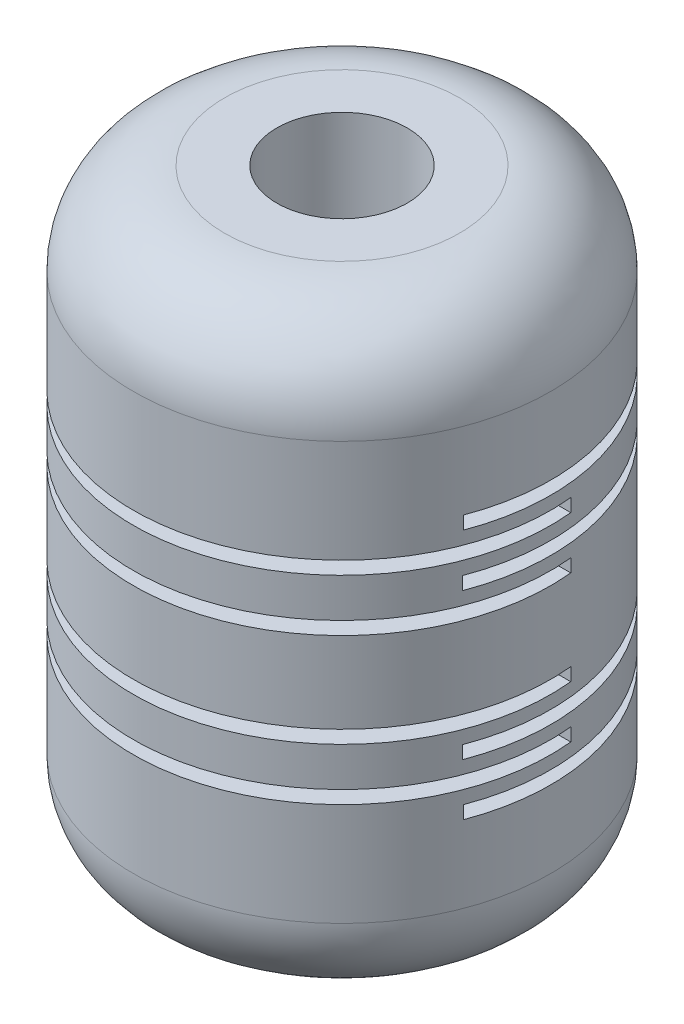
ISO-10303-21;
HEADER;
FILE_DESCRIPTION(('STEP AP214'),'2;1');
FILE_NAME('part.step','',(''),(''),'','','');
FILE_SCHEMA(('AUTOMOTIVE_DESIGN { 1 0 10303 214 1 1 1 1 }'));
ENDSEC;
DATA;
#1=APPLICATION_CONTEXT('core data for automotive mechanical design processes');
#2=APPLICATION_PROTOCOL_DEFINITION('international standard','automotive_design',2000,#1);
#3=PRODUCT_CONTEXT('',#1,'mechanical');
#4=PRODUCT('Part','Part','',(#3));
#5=PRODUCT_RELATED_PRODUCT_CATEGORY('part','',(#4));
#6=PRODUCT_DEFINITION_FORMATION('','',#4);
#7=PRODUCT_DEFINITION_CONTEXT('part definition',#1,'design');
#8=PRODUCT_DEFINITION('design','',#6,#7);
#9=PRODUCT_DEFINITION_SHAPE('','',#8);
#10=(LENGTH_UNIT() NAMED_UNIT(*) SI_UNIT(.MILLI.,.METRE.));
#11=(NAMED_UNIT(*) PLANE_ANGLE_UNIT() SI_UNIT($,.RADIAN.));
#12=(NAMED_UNIT(*) SI_UNIT($,.STERADIAN.) SOLID_ANGLE_UNIT());
#13=UNCERTAINTY_MEASURE_WITH_UNIT(LENGTH_MEASURE(1.E-05),#10,'distance_accuracy_value','');
#14=(GEOMETRIC_REPRESENTATION_CONTEXT(3) GLOBAL_UNCERTAINTY_ASSIGNED_CONTEXT((#13)) GLOBAL_UNIT_ASSIGNED_CONTEXT((#10,
#11,#12)) REPRESENTATION_CONTEXT('',''));
#15=CARTESIAN_POINT('',(0.,0.,0.));
#16=DIRECTION('',(0.,0.,1.));
#17=DIRECTION('',(1.,0.,0.));
#18=AXIS2_PLACEMENT_3D('',#15,#16,#17);
#19=CARTESIAN_POINT('',(-32.4453380376427,-3.83426816016442,-0.806915282737464));
#20=DIRECTION('',(0.,0.,1.));
#21=DIRECTION('',(0.,-1.,0.));
#22=AXIS2_PLACEMENT_3D('',#19,#20,#21);
#23=PLANE('',#22);
#24=DIRECTION('',(0.,-1.,0.));
#25=VECTOR('',#24,1.);
#26=CARTESIAN_POINT('',(-2.36619689089575,20.7745316098034,-0.806915282737455));
#27=LINE('',#26,#25);
#28=CARTESIAN_POINT('',(-2.36619689089575,-3.5556055847556,-0.806915282737455));
#29=VERTEX_POINT('',#28);
#30=CARTESIAN_POINT('',(-2.36619689089575,-4.0556055847556,-0.806915282737464));
#31=VERTEX_POINT('',#30);
#32=EDGE_CURVE('E39',#29,#31,#27,.T.);
#33=ORIENTED_EDGE('',*,*,#32,.F.);
#34=DIRECTION('',(1.,0.,0.));
#35=VECTOR('',#34,1.);
#36=CARTESIAN_POINT('',(-32.4453380376427,-3.5556055847556,-0.806915282737463));
#37=LINE('',#36,#35);
#38=CARTESIAN_POINT('',(-7.9592014503017,-3.5556055847556,-0.806915282737463));
#39=VERTEX_POINT('',#38);
#40=EDGE_CURVE('E284',#39,#29,#37,.T.);
#41=ORIENTED_EDGE('',*,*,#40,.F.);
#42=DIRECTION('',(0.,1.,0.));
#43=VECTOR('',#42,1.);
#44=CARTESIAN_POINT('',(-7.9592014503017,-11.5,-0.806915282737467));
#45=LINE('',#44,#43);
#46=CARTESIAN_POINT('',(-7.9592014503017,-4.0556055847556,-0.806915282737464));
#47=VERTEX_POINT('',#46);
#48=EDGE_CURVE('E321',#39,#47,#45,.F.);
#49=ORIENTED_EDGE('',*,*,#48,.T.);
#50=DIRECTION('',(1.,0.,0.));
#51=VECTOR('',#50,1.);
#52=CARTESIAN_POINT('',(-32.4453380376427,-4.0556055847556,-0.806915282737464));
#53=LINE('',#52,#51);
#54=EDGE_CURVE('E278',#47,#31,#53,.T.);
#55=ORIENTED_EDGE('',*,*,#54,.T.);
#56=EDGE_LOOP('',(#33,#41,#49,#55));
#57=FACE_BOUND('',#56,.T.);
#58=ADVANCED_FACE('F17',(#57),#23,.T.);
#59=CARTESIAN_POINT('',(-32.6569119482311,-1.43952399957925,-0.806915282737464));
#60=DIRECTION('',(0.,0.,-1.));
#61=DIRECTION('',(-1.,0.,0.));
#62=AXIS2_PLACEMENT_3D('',#59,#60,#61);
#63=PLANE('',#62);
#64=DIRECTION('',(1.,0.,0.));
#65=VECTOR('',#64,1.);
#66=CARTESIAN_POINT('',(-32.6569119482311,-1.5556055847556,-0.806915282737463));
#67=LINE('',#66,#65);
#68=CARTESIAN_POINT('',(2.36619689089575,-1.5556055847556,-0.806915282737463));
#69=VERTEX_POINT('',#68);
#70=CARTESIAN_POINT('',(7.9592014503017,-1.5556055847556,-0.806915282737463));
#71=VERTEX_POINT('',#70);
#72=EDGE_CURVE('E303',#69,#71,#67,.T.);
#73=ORIENTED_EDGE('',*,*,#72,.F.);
#74=DIRECTION('',(0.,-1.,0.));
#75=VECTOR('',#74,1.);
#76=CARTESIAN_POINT('',(2.36619689089575,20.7745316098034,-0.806915282737464));
#77=LINE('',#76,#75);
#78=CARTESIAN_POINT('',(2.36619689089575,-2.05560558475559,-0.806915282737464));
#79=VERTEX_POINT('',#78);
#80=EDGE_CURVE('E51',#69,#79,#77,.T.);
#81=ORIENTED_EDGE('',*,*,#80,.T.);
#82=DIRECTION('',(1.,0.,0.));
#83=VECTOR('',#82,1.);
#84=CARTESIAN_POINT('',(-32.6569119482311,-2.0556055847556,-0.806915282737463));
#85=LINE('',#84,#83);
#86=CARTESIAN_POINT('',(7.95920145030171,-2.0556055847556,-0.806915282737463));
#87=VERTEX_POINT('',#86);
#88=EDGE_CURVE('E302',#79,#87,#85,.T.);
#89=ORIENTED_EDGE('',*,*,#88,.T.);
#90=DIRECTION('',(0.,1.,0.));
#91=VECTOR('',#90,1.);
#92=CARTESIAN_POINT('',(7.9592014503017,-11.5,-0.806915282737464));
#93=LINE('',#92,#91);
#94=EDGE_CURVE('E350',#71,#87,#93,.F.);
#95=ORIENTED_EDGE('',*,*,#94,.F.);
#96=EDGE_LOOP('',(#73,#81,#89,#95));
#97=FACE_BOUND('',#96,.T.);
#98=ADVANCED_FACE('F534',(#97),#63,.F.);
#99=CARTESIAN_POINT('',(-32.4453380376427,3.83426816016442,-0.806915282737464));
#100=DIRECTION('',(0.,0.,-1.));
#101=DIRECTION('',(0.,1.,0.));
#102=AXIS2_PLACEMENT_3D('',#99,#100,#101);
#103=PLANE('',#102);
#104=DIRECTION('',(1.,0.,0.));
#105=VECTOR('',#104,1.);
#106=CARTESIAN_POINT('',(-32.4453380376427,4.0556055847556,-0.806915282737464));
#107=LINE('',#106,#105);
#108=CARTESIAN_POINT('',(2.36619689089575,4.0556055847556,-0.806915282737464));
#109=VERTEX_POINT('',#108);
#110=CARTESIAN_POINT('',(7.9592014503017,4.0556055847556,-0.806915282737464));
#111=VERTEX_POINT('',#110);
#112=EDGE_CURVE('E312',#109,#111,#107,.T.);
#113=ORIENTED_EDGE('',*,*,#112,.F.);
#114=DIRECTION('',(0.,-1.,0.));
#115=VECTOR('',#114,1.);
#116=CARTESIAN_POINT('',(2.36619689089575,20.7745316098034,-0.80691528273747));
#117=LINE('',#116,#115);
#118=CARTESIAN_POINT('',(2.36619689089575,3.5556055847556,-0.80691528273747));
#119=VERTEX_POINT('',#118);
#120=EDGE_CURVE('E623',#109,#119,#117,.T.);
#121=ORIENTED_EDGE('',*,*,#120,.T.);
#122=DIRECTION('',(1.,0.,0.));
#123=VECTOR('',#122,1.);
#124=CARTESIAN_POINT('',(-32.4453380376427,3.5556055847556,-0.806915282737464));
#125=LINE('',#124,#123);
#126=CARTESIAN_POINT('',(7.95920145030171,3.5556055847556,-0.806915282737464));
#127=VERTEX_POINT('',#126);
#128=EDGE_CURVE('E311',#119,#127,#125,.T.);
#129=ORIENTED_EDGE('',*,*,#128,.T.);
#130=DIRECTION('',(0.,1.,0.));
#131=VECTOR('',#130,1.);
#132=CARTESIAN_POINT('',(7.9592014503017,-11.5,-0.806915282737458));
#133=LINE('',#132,#131);
#134=EDGE_CURVE('E365',#111,#127,#133,.F.);
#135=ORIENTED_EDGE('',*,*,#134,.F.);
#136=EDGE_LOOP('',(#113,#121,#129,#135));
#137=FACE_BOUND('',#136,.T.);
#138=ADVANCED_FACE('F541',(#137),#103,.F.);
#139=CARTESIAN_POINT('',(-32.6569119482311,1.43952399957925,-0.806915282737464));
#140=DIRECTION('',(0.,0.,1.));
#141=DIRECTION('',(1.,0.,0.));
#142=AXIS2_PLACEMENT_3D('',#139,#140,#141);
#143=PLANE('',#142);
#144=DIRECTION('',(0.,-1.,0.));
#145=VECTOR('',#144,1.);
#146=CARTESIAN_POINT('',(-2.36619689089575,20.7745316098034,-0.806915282737464));
#147=LINE('',#146,#145);
#148=CARTESIAN_POINT('',(-2.36619689089575,2.05560558475559,-0.806915282737464));
#149=VERTEX_POINT('',#148);
#150=CARTESIAN_POINT('',(-2.36619689089575,1.5556055847556,-0.806915282737463));
#151=VERTEX_POINT('',#150);
#152=EDGE_CURVE('E238',#149,#151,#147,.T.);
#153=ORIENTED_EDGE('',*,*,#152,.F.);
#154=DIRECTION('',(1.,0.,0.));
#155=VECTOR('',#154,1.);
#156=CARTESIAN_POINT('',(-32.6569119482311,2.0556055847556,-0.806915282737463));
#157=LINE('',#156,#155);
#158=CARTESIAN_POINT('',(-7.9592014503017,2.0556055847556,-0.806915282737463));
#159=VERTEX_POINT('',#158);
#160=EDGE_CURVE('E273',#159,#149,#157,.T.);
#161=ORIENTED_EDGE('',*,*,#160,.F.);
#162=DIRECTION('',(0.,1.,0.));
#163=VECTOR('',#162,1.);
#164=CARTESIAN_POINT('',(-7.9592014503017,-11.5,-0.806915282737464));
#165=LINE('',#164,#163);
#166=CARTESIAN_POINT('',(-7.9592014503017,1.5556055847556,-0.806915282737463));
#167=VERTEX_POINT('',#166);
#168=EDGE_CURVE('E409',#159,#167,#165,.F.);
#169=ORIENTED_EDGE('',*,*,#168,.T.);
#170=DIRECTION('',(1.,0.,0.));
#171=VECTOR('',#170,1.);
#172=CARTESIAN_POINT('',(-32.6569119482311,1.5556055847556,-0.806915282737463));
#173=LINE('',#172,#171);
#174=EDGE_CURVE('E259',#167,#151,#173,.T.);
#175=ORIENTED_EDGE('',*,*,#174,.T.);
#176=EDGE_LOOP('',(#153,#161,#169,#175));
#177=FACE_BOUND('',#176,.T.);
#178=ADVANCED_FACE('F458',(#177),#143,.T.);
#179=CARTESIAN_POINT('',(0.,-11.5,0.));
#180=DIRECTION('',(0.,1.,0.));
#181=DIRECTION('',(0.,0.,1.));
#182=AXIS2_PLACEMENT_3D('',#179,#180,#181);
#183=CYLINDRICAL_SURFACE('',#182,8.);
#184=CARTESIAN_POINT('',(0.,8.,0.));
#185=DIRECTION('',(0.,-1.,0.));
#186=DIRECTION('',(0.,0.,-1.));
#187=AXIS2_PLACEMENT_3D('',#184,#185,#186);
#188=CIRCLE('',#187,8.);
#189=CARTESIAN_POINT('',(0.,8.,-8.));
#190=VERTEX_POINT('',#189);
#191=EDGE_CURVE('E437',#190,#190,#188,.T.);
#192=ORIENTED_EDGE('',*,*,#191,.T.);
#193=EDGE_LOOP('',(#192));
#194=FACE_BOUND('',#193,.T.);
#195=CARTESIAN_POINT('',(0.,-8.,0.));
#196=DIRECTION('',(0.,-1.,0.));
#197=DIRECTION('',(0.,0.,-1.));
#198=AXIS2_PLACEMENT_3D('',#195,#196,#197);
#199=CIRCLE('',#198,8.);
#200=CARTESIAN_POINT('',(0.,-8.,-8.));
#201=VERTEX_POINT('',#200);
#202=EDGE_CURVE('E433',#201,#201,#199,.F.);
#203=ORIENTED_EDGE('',*,*,#202,.T.);
#204=EDGE_LOOP('',(#203));
#205=FACE_BOUND('',#204,.T.);
#206=CARTESIAN_POINT('',(0.,2.0556055847556,0.));
#207=DIRECTION('',(0.,-1.,0.));
#208=DIRECTION('',(0.,0.,-1.));
#209=AXIS2_PLACEMENT_3D('',#206,#207,#208);
#210=CIRCLE('',#209,8.);
#211=CARTESIAN_POINT('',(7.9592014503017,2.0556055847556,-0.806915282737463));
#212=VERTEX_POINT('',#211);
#213=EDGE_CURVE('E416',#212,#159,#210,.T.);
#214=ORIENTED_EDGE('',*,*,#213,.F.);
#215=DIRECTION('',(0.,1.,0.));
#216=VECTOR('',#215,1.);
#217=CARTESIAN_POINT('',(7.9592014503017,-11.5,-0.806915282737464));
#218=LINE('',#217,#216);
#219=CARTESIAN_POINT('',(7.9592014503017,1.5556055847556,-0.806915282737463));
#220=VERTEX_POINT('',#219);
#221=EDGE_CURVE('E413',#220,#212,#218,.T.);
#222=ORIENTED_EDGE('',*,*,#221,.F.);
#223=CARTESIAN_POINT('',(0.,1.5556055847556,0.));
#224=DIRECTION('',(0.,-1.,0.));
#225=DIRECTION('',(0.,0.,-1.));
#226=AXIS2_PLACEMENT_3D('',#223,#224,#225);
#227=CIRCLE('',#226,8.);
#228=EDGE_CURVE('E256',#220,#167,#227,.T.);
#229=ORIENTED_EDGE('',*,*,#228,.T.);
#230=ORIENTED_EDGE('',*,*,#168,.F.);
#231=EDGE_LOOP('',(#214,#222,#229,#230));
#232=FACE_BOUND('',#231,.T.);
#233=CARTESIAN_POINT('',(0.,-3.0556055847556,0.));
#234=DIRECTION('',(0.,1.,0.));
#235=DIRECTION('',(0.,0.,1.));
#236=AXIS2_PLACEMENT_3D('',#233,#234,#235);
#237=CIRCLE('',#236,8.);
#238=CARTESIAN_POINT('',(7.47467309621452,-3.0556055847556,2.85118608735502));
#239=VERTEX_POINT('',#238);
#240=CARTESIAN_POINT('',(-7.47467309621452,-3.0556055847556,2.85118608735502));
#241=VERTEX_POINT('',#240);
#242=EDGE_CURVE('E344',#239,#241,#237,.T.);
#243=ORIENTED_EDGE('',*,*,#242,.F.);
#244=DIRECTION('',(0.,1.,0.));
#245=VECTOR('',#244,1.);
#246=CARTESIAN_POINT('',(7.47467309621452,-11.5,2.85118608735502));
#247=LINE('',#246,#245);
#248=CARTESIAN_POINT('',(7.47467309621452,-2.5556055847556,2.85118608735502));
#249=VERTEX_POINT('',#248);
#250=EDGE_CURVE('E337',#249,#239,#247,.F.);
#251=ORIENTED_EDGE('',*,*,#250,.F.);
#252=CARTESIAN_POINT('',(0.,-2.5556055847556,0.));
#253=DIRECTION('',(0.,1.,0.));
#254=DIRECTION('',(0.,0.,1.));
#255=AXIS2_PLACEMENT_3D('',#252,#253,#254);
#256=CIRCLE('',#255,8.);
#257=CARTESIAN_POINT('',(-7.47467309621452,-2.5556055847556,2.85118608735502));
#258=VERTEX_POINT('',#257);
#259=EDGE_CURVE('E333',#249,#258,#256,.T.);
#260=ORIENTED_EDGE('',*,*,#259,.T.);
#261=DIRECTION('',(0.,1.,0.));
#262=VECTOR('',#261,1.);
#263=CARTESIAN_POINT('',(-7.47467309621452,-11.5,2.85118608735502));
#264=LINE('',#263,#262);
#265=EDGE_CURVE('E340',#241,#258,#264,.T.);
#266=ORIENTED_EDGE('',*,*,#265,.F.);
#267=EDGE_LOOP('',(#243,#251,#260,#266));
#268=FACE_BOUND('',#267,.T.);
#269=CARTESIAN_POINT('',(0.,-3.5556055847556,0.));
#270=DIRECTION('',(0.,-1.,0.));
#271=DIRECTION('',(0.,0.,-1.));
#272=AXIS2_PLACEMENT_3D('',#269,#270,#271);
#273=CIRCLE('',#272,8.);
#274=CARTESIAN_POINT('',(7.9592014503017,-3.5556055847556,-0.806915282737463));
#275=VERTEX_POINT('',#274);
#276=EDGE_CURVE('E330',#275,#39,#273,.T.);
#277=ORIENTED_EDGE('',*,*,#276,.F.);
#278=DIRECTION('',(0.,1.,0.));
#279=VECTOR('',#278,1.);
#280=CARTESIAN_POINT('',(7.9592014503017,-11.5,-0.806915282737467));
#281=LINE('',#280,#279);
#282=CARTESIAN_POINT('',(7.9592014503017,-4.0556055847556,-0.806915282737464));
#283=VERTEX_POINT('',#282);
#284=EDGE_CURVE('E326',#283,#275,#281,.T.);
#285=ORIENTED_EDGE('',*,*,#284,.F.);
#286=CARTESIAN_POINT('',(0.,-4.0556055847556,0.));
#287=DIRECTION('',(0.,-1.,0.));
#288=DIRECTION('',(0.,0.,-1.));
#289=AXIS2_PLACEMENT_3D('',#286,#287,#288);
#290=CIRCLE('',#289,8.);
#291=EDGE_CURVE('E317',#283,#47,#290,.T.);
#292=ORIENTED_EDGE('',*,*,#291,.T.);
#293=ORIENTED_EDGE('',*,*,#48,.F.);
#294=EDGE_LOOP('',(#277,#285,#292,#293));
#295=FACE_BOUND('',#294,.T.);
#296=ORIENTED_EDGE('',*,*,#94,.T.);
#297=CARTESIAN_POINT('',(0.,-2.0556055847556,0.));
#298=DIRECTION('',(0.,-1.,0.));
#299=DIRECTION('',(0.,0.,-1.));
#300=AXIS2_PLACEMENT_3D('',#297,#298,#299);
#301=CIRCLE('',#300,8.);
#302=CARTESIAN_POINT('',(-7.95920145030171,-2.0556055847556,-0.806915282737463));
#303=VERTEX_POINT('',#302);
#304=EDGE_CURVE('E358',#87,#303,#301,.T.);
#305=ORIENTED_EDGE('',*,*,#304,.T.);
#306=DIRECTION('',(0.,1.,0.));
#307=VECTOR('',#306,1.);
#308=CARTESIAN_POINT('',(-7.9592014503017,-11.5,-0.806915282737464));
#309=LINE('',#308,#307);
#310=CARTESIAN_POINT('',(-7.9592014503017,-1.5556055847556,-0.806915282737463));
#311=VERTEX_POINT('',#310);
#312=EDGE_CURVE('E354',#303,#311,#309,.T.);
#313=ORIENTED_EDGE('',*,*,#312,.T.);
#314=CARTESIAN_POINT('',(0.,-1.5556055847556,0.));
#315=DIRECTION('',(0.,-1.,0.));
#316=DIRECTION('',(0.,0.,-1.));
#317=AXIS2_PLACEMENT_3D('',#314,#315,#316);
#318=CIRCLE('',#317,8.);
#319=EDGE_CURVE('E347',#71,#311,#318,.T.);
#320=ORIENTED_EDGE('',*,*,#319,.F.);
#321=EDGE_LOOP('',(#296,#305,#313,#320));
#322=FACE_BOUND('',#321,.T.);
#323=ORIENTED_EDGE('',*,*,#134,.T.);
#324=CARTESIAN_POINT('',(0.,3.5556055847556,0.));
#325=DIRECTION('',(0.,-1.,0.));
#326=DIRECTION('',(0.,0.,-1.));
#327=AXIS2_PLACEMENT_3D('',#324,#325,#326);
#328=CIRCLE('',#327,8.);
#329=CARTESIAN_POINT('',(-7.95920145030171,3.5556055847556,-0.806915282737464));
#330=VERTEX_POINT('',#329);
#331=EDGE_CURVE('E373',#127,#330,#328,.T.);
#332=ORIENTED_EDGE('',*,*,#331,.T.);
#333=DIRECTION('',(0.,1.,0.));
#334=VECTOR('',#333,1.);
#335=CARTESIAN_POINT('',(-7.9592014503017,-11.5,-0.806915282737458));
#336=LINE('',#335,#334);
#337=CARTESIAN_POINT('',(-7.9592014503017,4.0556055847556,-0.806915282737464));
#338=VERTEX_POINT('',#337);
#339=EDGE_CURVE('E369',#330,#338,#336,.T.);
#340=ORIENTED_EDGE('',*,*,#339,.T.);
#341=CARTESIAN_POINT('',(0.,4.0556055847556,0.));
#342=DIRECTION('',(0.,-1.,0.));
#343=DIRECTION('',(0.,0.,-1.));
#344=AXIS2_PLACEMENT_3D('',#341,#342,#343);
#345=CIRCLE('',#344,8.);
#346=EDGE_CURVE('E362',#111,#338,#345,.T.);
#347=ORIENTED_EDGE('',*,*,#346,.F.);
#348=EDGE_LOOP('',(#323,#332,#340,#347));
#349=FACE_BOUND('',#348,.T.);
#350=DIRECTION('',(0.,1.,0.));
#351=VECTOR('',#350,1.);
#352=CARTESIAN_POINT('',(7.47467309621452,-11.5,2.85118608735502));
#353=LINE('',#352,#351);
#354=CARTESIAN_POINT('',(7.47467309621452,2.5556055847556,2.85118608735502));
#355=VERTEX_POINT('',#354);
#356=CARTESIAN_POINT('',(7.47467309621452,3.0556055847556,2.85118608735502));
#357=VERTEX_POINT('',#356);
#358=EDGE_CURVE('E384',#355,#357,#353,.T.);
#359=ORIENTED_EDGE('',*,*,#358,.T.);
#360=CARTESIAN_POINT('',(0.,3.0556055847556,0.));
#361=DIRECTION('',(0.,1.,0.));
#362=DIRECTION('',(0.,0.,1.));
#363=AXIS2_PLACEMENT_3D('',#360,#361,#362);
#364=CIRCLE('',#363,8.);
#365=CARTESIAN_POINT('',(-7.47467309621452,3.0556055847556,2.85118608735502));
#366=VERTEX_POINT('',#365);
#367=EDGE_CURVE('E388',#357,#366,#364,.T.);
#368=ORIENTED_EDGE('',*,*,#367,.T.);
#369=DIRECTION('',(0.,1.,0.));
#370=VECTOR('',#369,1.);
#371=CARTESIAN_POINT('',(-7.47467309621452,-11.5,2.85118608735502));
#372=LINE('',#371,#370);
#373=CARTESIAN_POINT('',(-7.47467309621452,2.5556055847556,2.85118608735502));
#374=VERTEX_POINT('',#373);
#375=EDGE_CURVE('E380',#366,#374,#372,.F.);
#376=ORIENTED_EDGE('',*,*,#375,.T.);
#377=CARTESIAN_POINT('',(0.,2.5556055847556,0.));
#378=DIRECTION('',(0.,1.,0.));
#379=DIRECTION('',(0.,0.,1.));
#380=AXIS2_PLACEMENT_3D('',#377,#378,#379);
#381=CIRCLE('',#380,8.);
#382=EDGE_CURVE('E377',#355,#374,#381,.T.);
#383=ORIENTED_EDGE('',*,*,#382,.F.);
#384=EDGE_LOOP('',(#359,#368,#376,#383));
#385=FACE_BOUND('',#384,.T.);
#386=CARTESIAN_POINT('',(0.,5.0556055847556,0.));
#387=DIRECTION('',(0.,-1.,0.));
#388=DIRECTION('',(0.,0.,-1.));
#389=AXIS2_PLACEMENT_3D('',#386,#387,#388);
#390=CIRCLE('',#389,8.);
#391=CARTESIAN_POINT('',(-7.48448014592821,5.0556055847556,2.82534191651321));
#392=VERTEX_POINT('',#391);
#393=CARTESIAN_POINT('',(7.4844801459282,5.0556055847556,2.82534191651321));
#394=VERTEX_POINT('',#393);
#395=EDGE_CURVE('E404',#392,#394,#390,.T.);
#396=ORIENTED_EDGE('',*,*,#395,.F.);
#397=DIRECTION('',(0.,1.,0.));
#398=VECTOR('',#397,1.);
#399=CARTESIAN_POINT('',(-7.4844801459282,-11.5,2.82534191651321));
#400=LINE('',#399,#398);
#401=CARTESIAN_POINT('',(-7.4844801459282,4.5556055847556,2.82534191651321));
#402=VERTEX_POINT('',#401);
#403=EDGE_CURVE('E396',#392,#402,#400,.F.);
#404=ORIENTED_EDGE('',*,*,#403,.T.);
#405=CARTESIAN_POINT('',(0.,4.5556055847556,0.));
#406=DIRECTION('',(0.,-1.,0.));
#407=DIRECTION('',(0.,0.,-1.));
#408=AXIS2_PLACEMENT_3D('',#405,#406,#407);
#409=CIRCLE('',#408,8.);
#410=CARTESIAN_POINT('',(7.4844801459282,4.5556055847556,2.82534191651321));
#411=VERTEX_POINT('',#410);
#412=EDGE_CURVE('E392',#402,#411,#409,.T.);
#413=ORIENTED_EDGE('',*,*,#412,.T.);
#414=DIRECTION('',(0.,1.,0.));
#415=VECTOR('',#414,1.);
#416=CARTESIAN_POINT('',(7.4844801459282,-11.5,2.82534191651321));
#417=LINE('',#416,#415);
#418=EDGE_CURVE('E400',#411,#394,#417,.T.);
#419=ORIENTED_EDGE('',*,*,#418,.T.);
#420=EDGE_LOOP('',(#396,#404,#413,#419));
#421=FACE_BOUND('',#420,.T.);
#422=DIRECTION('',(0.,1.,0.));
#423=VECTOR('',#422,1.);
#424=CARTESIAN_POINT('',(-7.4844801459282,-11.5,2.82534191651321));
#425=LINE('',#424,#423);
#426=CARTESIAN_POINT('',(-7.48448014592821,-5.0556055847556,2.82534191651321));
#427=VERTEX_POINT('',#426);
#428=CARTESIAN_POINT('',(-7.48448014592821,-4.5556055847556,2.82534191651321));
#429=VERTEX_POINT('',#428);
#430=EDGE_CURVE('E430',#427,#429,#425,.T.);
#431=ORIENTED_EDGE('',*,*,#430,.F.);
#432=CARTESIAN_POINT('',(0.,-5.0556055847556,0.));
#433=DIRECTION('',(0.,-1.,0.));
#434=DIRECTION('',(0.,0.,-1.));
#435=AXIS2_PLACEMENT_3D('',#432,#433,#434);
#436=CIRCLE('',#435,8.);
#437=CARTESIAN_POINT('',(7.4844801459282,-5.0556055847556,2.82534191651321));
#438=VERTEX_POINT('',#437);
#439=EDGE_CURVE('E426',#427,#438,#436,.T.);
#440=ORIENTED_EDGE('',*,*,#439,.T.);
#441=DIRECTION('',(0.,1.,0.));
#442=VECTOR('',#441,1.);
#443=CARTESIAN_POINT('',(7.4844801459282,-11.5,2.82534191651321));
#444=LINE('',#443,#442);
#445=CARTESIAN_POINT('',(7.4844801459282,-4.5556055847556,2.82534191651321));
#446=VERTEX_POINT('',#445);
#447=EDGE_CURVE('E419',#446,#438,#444,.F.);
#448=ORIENTED_EDGE('',*,*,#447,.F.);
#449=CARTESIAN_POINT('',(0.,-4.5556055847556,0.));
#450=DIRECTION('',(0.,-1.,0.));
#451=DIRECTION('',(0.,0.,-1.));
#452=AXIS2_PLACEMENT_3D('',#449,#450,#451);
#453=CIRCLE('',#452,8.);
#454=EDGE_CURVE('E422',#429,#446,#453,.T.);
#455=ORIENTED_EDGE('',*,*,#454,.F.);
#456=EDGE_LOOP('',(#431,#440,#448,#455));
#457=FACE_BOUND('',#456,.T.);
#458=ADVANCED_FACE('F454',(#194,#205,#232,#268,#295,#322,#349,#385,#421,#457),#183,.T.);
#459=CARTESIAN_POINT('',(0.,-11.5,0.));
#460=DIRECTION('',(0.,-1.,0.));
#461=DIRECTION('',(1.,0.,0.));
#462=AXIS2_PLACEMENT_3D('',#459,#460,#461);
#463=PLANE('',#462);
#464=CARTESIAN_POINT('',(0.,-11.5,0.));
#465=DIRECTION('',(0.,-1.,0.));
#466=DIRECTION('',(1.,0.,0.));
#467=AXIS2_PLACEMENT_3D('',#464,#465,#466);
#468=CIRCLE('',#467,2.5);
#469=CARTESIAN_POINT('',(2.5,-11.5,0.));
#470=VERTEX_POINT('',#469);
#471=EDGE_CURVE('E679',#470,#470,#468,.T.);
#472=ORIENTED_EDGE('',*,*,#471,.F.);
#473=EDGE_LOOP('',(#472));
#474=FACE_BOUND('',#473,.T.);
#475=CARTESIAN_POINT('',(0.,-11.5,0.));
#476=DIRECTION('',(0.,-1.,0.));
#477=DIRECTION('',(0.,0.,-1.));
#478=AXIS2_PLACEMENT_3D('',#475,#476,#477);
#479=CIRCLE('',#478,4.5);
#480=CARTESIAN_POINT('',(0.,-11.5,-4.5));
#481=VERTEX_POINT('',#480);
#482=EDGE_CURVE('E11',#481,#481,#479,.T.);
#483=ORIENTED_EDGE('',*,*,#482,.T.);
#484=EDGE_LOOP('',(#483));
#485=FACE_BOUND('',#484,.T.);
#486=ADVANCED_FACE('F457',(#474,#485),#463,.T.);
#487=CARTESIAN_POINT('',(0.,11.5,0.));
#488=DIRECTION('',(0.,-1.,0.));
#489=DIRECTION('',(1.,0.,0.));
#490=AXIS2_PLACEMENT_3D('',#487,#488,#489);
#491=PLANE('',#490);
#492=CARTESIAN_POINT('',(0.,11.5,0.));
#493=DIRECTION('',(0.,-1.,0.));
#494=DIRECTION('',(0.,0.,-1.));
#495=AXIS2_PLACEMENT_3D('',#492,#493,#494);
#496=CIRCLE('',#495,2.5);
#497=CARTESIAN_POINT('',(0.,11.5,-2.5));
#498=VERTEX_POINT('',#497);
#499=EDGE_CURVE('E260',#498,#498,#496,.T.);
#500=ORIENTED_EDGE('',*,*,#499,.T.);
#501=EDGE_LOOP('',(#500));
#502=FACE_BOUND('',#501,.T.);
#503=CARTESIAN_POINT('',(0.,11.5,0.));
#504=DIRECTION('',(0.,-1.,0.));
#505=DIRECTION('',(0.,0.,-1.));
#506=AXIS2_PLACEMENT_3D('',#503,#504,#505);
#507=CIRCLE('',#506,4.5);
#508=CARTESIAN_POINT('',(0.,11.5,-4.5));
#509=VERTEX_POINT('',#508);
#510=EDGE_CURVE('E27',#509,#509,#507,.F.);
#511=ORIENTED_EDGE('',*,*,#510,.T.);
#512=EDGE_LOOP('',(#511));
#513=FACE_BOUND('',#512,.T.);
#514=ADVANCED_FACE('F446',(#502,#513),#491,.F.);
#515=DIRECTION('',(0.,-1.,0.));
#516=VECTOR('',#515,1.);
#517=CARTESIAN_POINT('',(2.36619689089575,20.7745316098034,-0.806915282737455));
#518=LINE('',#517,#516);
#519=CARTESIAN_POINT('',(2.36619689089575,-4.0556055847556,-0.806915282737464));
#520=VERTEX_POINT('',#519);
#521=CARTESIAN_POINT('',(2.36619689089575,-3.5556055847556,-0.806915282737455));
#522=VERTEX_POINT('',#521);
#523=EDGE_CURVE('E560',#520,#522,#518,.F.);
#524=ORIENTED_EDGE('',*,*,#523,.F.);
#525=EDGE_CURVE('E283',#520,#283,#53,.T.);
#526=ORIENTED_EDGE('',*,*,#525,.T.);
#527=ORIENTED_EDGE('',*,*,#284,.T.);
#528=EDGE_CURVE('E282',#522,#275,#37,.T.);
#529=ORIENTED_EDGE('',*,*,#528,.F.);
#530=EDGE_LOOP('',(#524,#526,#527,#529));
#531=FACE_BOUND('',#530,.T.);
#532=ADVANCED_FACE('F537',(#531),#23,.T.);
#533=CARTESIAN_POINT('',(-32.4453380376427,-3.55560558475561,3.76739227795042));
#534=DIRECTION('',(0.,-1.,0.));
#535=DIRECTION('',(0.,0.,-1.));
#536=AXIS2_PLACEMENT_3D('',#533,#534,#535);
#537=PLANE('',#536);
#538=CARTESIAN_POINT('',(0.,-3.5556055847556,0.));
#539=DIRECTION('',(0.,-1.,0.));
#540=DIRECTION('',(0.,0.,-1.));
#541=AXIS2_PLACEMENT_3D('',#538,#539,#540);
#542=CIRCLE('',#541,2.5);
#543=EDGE_CURVE('E267',#522,#29,#542,.T.);
#544=ORIENTED_EDGE('',*,*,#543,.F.);
#545=ORIENTED_EDGE('',*,*,#528,.T.);
#546=ORIENTED_EDGE('',*,*,#276,.T.);
#547=ORIENTED_EDGE('',*,*,#40,.T.);
#548=EDGE_LOOP('',(#544,#545,#546,#547));
#549=FACE_BOUND('',#548,.T.);
#550=ADVANCED_FACE('F548',(#549),#537,.T.);
#551=CARTESIAN_POINT('',(-32.4453380376427,-4.0556055847556,3.76739227795042));
#552=DIRECTION('',(0.,-1.,0.));
#553=DIRECTION('',(0.,0.,-1.));
#554=AXIS2_PLACEMENT_3D('',#551,#552,#553);
#555=PLANE('',#554);
#556=ORIENTED_EDGE('',*,*,#525,.F.);
#557=CARTESIAN_POINT('',(0.,-4.0556055847556,0.));
#558=DIRECTION('',(0.,-1.,0.));
#559=DIRECTION('',(0.,0.,-1.));
#560=AXIS2_PLACEMENT_3D('',#557,#558,#559);
#561=CIRCLE('',#560,2.5);
#562=EDGE_CURVE('E565',#520,#31,#561,.T.);
#563=ORIENTED_EDGE('',*,*,#562,.T.);
#564=ORIENTED_EDGE('',*,*,#54,.F.);
#565=ORIENTED_EDGE('',*,*,#291,.F.);
#566=EDGE_LOOP('',(#556,#563,#564,#565));
#567=FACE_BOUND('',#566,.T.);
#568=ADVANCED_FACE('F554',(#567),#555,.F.);
#569=CARTESIAN_POINT('',(-32.7885763689421,-2.72397413058213,2.85118608735502));
#570=DIRECTION('',(0.,0.,-1.));
#571=DIRECTION('',(-1.,0.,0.));
#572=AXIS2_PLACEMENT_3D('',#569,#570,#571);
#573=PLANE('',#572);
#574=ORIENTED_EDGE('',*,*,#265,.T.);
#575=DIRECTION('',(1.,0.,0.));
#576=VECTOR('',#575,1.);
#577=CARTESIAN_POINT('',(-32.7885763689421,-2.5556055847556,2.85118608735502));
#578=LINE('',#577,#576);
#579=EDGE_CURVE('E289',#258,#249,#578,.T.);
#580=ORIENTED_EDGE('',*,*,#579,.T.);
#581=ORIENTED_EDGE('',*,*,#250,.T.);
#582=DIRECTION('',(1.,0.,0.));
#583=VECTOR('',#582,1.);
#584=CARTESIAN_POINT('',(-32.7885763689421,-3.0556055847556,2.85118608735502));
#585=LINE('',#584,#583);
#586=EDGE_CURVE('E293',#241,#239,#585,.T.);
#587=ORIENTED_EDGE('',*,*,#586,.F.);
#588=EDGE_LOOP('',(#574,#580,#581,#587));
#589=FACE_BOUND('',#588,.T.);
#590=ADVANCED_FACE('F967',(#589),#573,.T.);
#591=CARTESIAN_POINT('',(-32.7885763689421,-3.0556055847556,-3.17239214200526));
#592=DIRECTION('',(0.,1.,0.));
#593=DIRECTION('',(0.,0.,1.));
#594=AXIS2_PLACEMENT_3D('',#591,#592,#593);
#595=PLANE('',#594);
#596=CARTESIAN_POINT('',(0.,-3.0556055847556,0.));
#597=DIRECTION('',(0.,1.,0.));
#598=DIRECTION('',(0.,0.,1.));
#599=AXIS2_PLACEMENT_3D('',#596,#597,#598);
#600=CIRCLE('',#599,2.5);
#601=CARTESIAN_POINT('',(0.,-3.0556055847556,2.5));
#602=VERTEX_POINT('',#601);
#603=EDGE_CURVE('E647',#602,#602,#600,.T.);
#604=ORIENTED_EDGE('',*,*,#603,.F.);
#605=EDGE_LOOP('',(#604));
#606=FACE_BOUND('',#605,.T.);
#607=ORIENTED_EDGE('',*,*,#242,.T.);
#608=ORIENTED_EDGE('',*,*,#586,.T.);
#609=EDGE_LOOP('',(#607,#608));
#610=FACE_BOUND('',#609,.T.);
#611=ADVANCED_FACE('F957',(#606,#610),#595,.T.);
#612=CARTESIAN_POINT('',(-32.7885763689421,-2.5556055847556,-3.17239214200526));
#613=DIRECTION('',(0.,1.,0.));
#614=DIRECTION('',(0.,0.,1.));
#615=AXIS2_PLACEMENT_3D('',#612,#613,#614);
#616=PLANE('',#615);
#617=CARTESIAN_POINT('',(0.,-2.5556055847556,0.));
#618=DIRECTION('',(0.,1.,0.));
#619=DIRECTION('',(0.,0.,1.));
#620=AXIS2_PLACEMENT_3D('',#617,#618,#619);
#621=CIRCLE('',#620,2.5);
#622=CARTESIAN_POINT('',(0.,-2.5556055847556,2.5));
#623=VERTEX_POINT('',#622);
#624=EDGE_CURVE('E643',#623,#623,#621,.T.);
#625=ORIENTED_EDGE('',*,*,#624,.T.);
#626=EDGE_LOOP('',(#625));
#627=FACE_BOUND('',#626,.T.);
#628=ORIENTED_EDGE('',*,*,#579,.F.);
#629=ORIENTED_EDGE('',*,*,#259,.F.);
#630=EDGE_LOOP('',(#628,#629));
#631=FACE_BOUND('',#630,.T.);
#632=ADVANCED_FACE('F946',(#627,#631),#616,.F.);
#633=CARTESIAN_POINT('',(-32.6569119482311,-2.0556055847556,3.97539758705534));
#634=DIRECTION('',(0.,-1.,0.));
#635=DIRECTION('',(0.,0.,-1.));
#636=AXIS2_PLACEMENT_3D('',#633,#634,#635);
#637=PLANE('',#636);
#638=ORIENTED_EDGE('',*,*,#88,.F.);
#639=CARTESIAN_POINT('',(0.,-2.0556055847556,0.));
#640=DIRECTION('',(0.,-1.,0.));
#641=DIRECTION('',(0.,0.,-1.));
#642=AXIS2_PLACEMENT_3D('',#639,#640,#641);
#643=CIRCLE('',#642,2.5);
#644=CARTESIAN_POINT('',(-2.36619689089575,-2.05560558475559,-0.806915282737464));
#645=VERTEX_POINT('',#644);
#646=EDGE_CURVE('E639',#79,#645,#643,.T.);
#647=ORIENTED_EDGE('',*,*,#646,.T.);
#648=EDGE_CURVE('E294',#303,#645,#85,.T.);
#649=ORIENTED_EDGE('',*,*,#648,.F.);
#650=ORIENTED_EDGE('',*,*,#304,.F.);
#651=EDGE_LOOP('',(#638,#647,#649,#650));
#652=FACE_BOUND('',#651,.T.);
#653=ADVANCED_FACE('F936',(#652),#637,.F.);
#654=ORIENTED_EDGE('',*,*,#648,.T.);
#655=DIRECTION('',(0.,-1.,0.));
#656=VECTOR('',#655,1.);
#657=CARTESIAN_POINT('',(-2.36619689089575,20.7745316098034,-0.806915282737464));
#658=LINE('',#657,#656);
#659=CARTESIAN_POINT('',(-2.36619689089575,-1.5556055847556,-0.806915282737463));
#660=VERTEX_POINT('',#659);
#661=EDGE_CURVE('E633',#645,#660,#658,.F.);
#662=ORIENTED_EDGE('',*,*,#661,.T.);
#663=EDGE_CURVE('E298',#311,#660,#67,.T.);
#664=ORIENTED_EDGE('',*,*,#663,.F.);
#665=ORIENTED_EDGE('',*,*,#312,.F.);
#666=EDGE_LOOP('',(#654,#662,#664,#665));
#667=FACE_BOUND('',#666,.T.);
#668=ADVANCED_FACE('F544',(#667),#63,.F.);
#669=CARTESIAN_POINT('',(-32.6569119482311,-1.5556055847556,3.97539758705534));
#670=DIRECTION('',(0.,-1.,0.));
#671=DIRECTION('',(0.,0.,-1.));
#672=AXIS2_PLACEMENT_3D('',#669,#670,#671);
#673=PLANE('',#672);
#674=CARTESIAN_POINT('',(0.,-1.5556055847556,0.));
#675=DIRECTION('',(0.,-1.,0.));
#676=DIRECTION('',(0.,0.,-1.));
#677=AXIS2_PLACEMENT_3D('',#674,#675,#676);
#678=CIRCLE('',#677,2.5);
#679=EDGE_CURVE('E630',#69,#660,#678,.T.);
#680=ORIENTED_EDGE('',*,*,#679,.F.);
#681=ORIENTED_EDGE('',*,*,#72,.T.);
#682=ORIENTED_EDGE('',*,*,#319,.T.);
#683=ORIENTED_EDGE('',*,*,#663,.T.);
#684=EDGE_LOOP('',(#680,#681,#682,#683));
#685=FACE_BOUND('',#684,.T.);
#686=ADVANCED_FACE('F915',(#685),#673,.T.);
#687=CARTESIAN_POINT('',(-32.4453380376427,3.55560558475561,3.76739227795042));
#688=DIRECTION('',(0.,-1.,0.));
#689=DIRECTION('',(0.,0.,-1.));
#690=AXIS2_PLACEMENT_3D('',#687,#688,#689);
#691=PLANE('',#690);
#692=ORIENTED_EDGE('',*,*,#128,.F.);
#693=CARTESIAN_POINT('',(0.,3.5556055847556,0.));
#694=DIRECTION('',(0.,-1.,0.));
#695=DIRECTION('',(0.,0.,-1.));
#696=AXIS2_PLACEMENT_3D('',#693,#694,#695);
#697=CIRCLE('',#696,2.5);
#698=CARTESIAN_POINT('',(-2.36619689089575,3.5556055847556,-0.80691528273747));
#699=VERTEX_POINT('',#698);
#700=EDGE_CURVE('E626',#119,#699,#697,.T.);
#701=ORIENTED_EDGE('',*,*,#700,.T.);
#702=EDGE_CURVE('E313',#330,#699,#125,.T.);
#703=ORIENTED_EDGE('',*,*,#702,.F.);
#704=ORIENTED_EDGE('',*,*,#331,.F.);
#705=EDGE_LOOP('',(#692,#701,#703,#704));
#706=FACE_BOUND('',#705,.T.);
#707=ADVANCED_FACE('F903',(#706),#691,.F.);
#708=ORIENTED_EDGE('',*,*,#702,.T.);
#709=DIRECTION('',(0.,-1.,0.));
#710=VECTOR('',#709,1.);
#711=CARTESIAN_POINT('',(-2.36619689089575,20.7745316098034,-0.80691528273747));
#712=LINE('',#711,#710);
#713=CARTESIAN_POINT('',(-2.36619689089575,4.0556055847556,-0.806915282737464));
#714=VERTEX_POINT('',#713);
#715=EDGE_CURVE('E619',#699,#714,#712,.F.);
#716=ORIENTED_EDGE('',*,*,#715,.T.);
#717=EDGE_CURVE('E307',#338,#714,#107,.T.);
#718=ORIENTED_EDGE('',*,*,#717,.F.);
#719=ORIENTED_EDGE('',*,*,#339,.F.);
#720=EDGE_LOOP('',(#708,#716,#718,#719));
#721=FACE_BOUND('',#720,.T.);
#722=ADVANCED_FACE('F892',(#721),#103,.F.);
#723=CARTESIAN_POINT('',(-32.4453380376427,4.0556055847556,3.76739227795042));
#724=DIRECTION('',(0.,-1.,0.));
#725=DIRECTION('',(0.,0.,-1.));
#726=AXIS2_PLACEMENT_3D('',#723,#724,#725);
#727=PLANE('',#726);
#728=CARTESIAN_POINT('',(0.,4.0556055847556,0.));
#729=DIRECTION('',(0.,-1.,0.));
#730=DIRECTION('',(0.,0.,-1.));
#731=AXIS2_PLACEMENT_3D('',#728,#729,#730);
#732=CIRCLE('',#731,2.5);
#733=EDGE_CURVE('E616',#109,#714,#732,.T.);
#734=ORIENTED_EDGE('',*,*,#733,.F.);
#735=ORIENTED_EDGE('',*,*,#112,.T.);
#736=ORIENTED_EDGE('',*,*,#346,.T.);
#737=ORIENTED_EDGE('',*,*,#717,.T.);
#738=EDGE_LOOP('',(#734,#735,#736,#737));
#739=FACE_BOUND('',#738,.T.);
#740=ADVANCED_FACE('F883',(#739),#727,.T.);
#741=CARTESIAN_POINT('',(-32.7885763689421,3.0556055847556,-3.17239214200526));
#742=DIRECTION('',(0.,1.,0.));
#743=DIRECTION('',(0.,0.,1.));
#744=AXIS2_PLACEMENT_3D('',#741,#742,#743);
#745=PLANE('',#744);
#746=CARTESIAN_POINT('',(0.,3.0556055847556,0.));
#747=DIRECTION('',(0.,1.,0.));
#748=DIRECTION('',(0.,0.,1.));
#749=AXIS2_PLACEMENT_3D('',#746,#747,#748);
#750=CIRCLE('',#749,2.5);
#751=CARTESIAN_POINT('',(0.,3.0556055847556,2.5));
#752=VERTEX_POINT('',#751);
#753=EDGE_CURVE('E612',#752,#752,#750,.T.);
#754=ORIENTED_EDGE('',*,*,#753,.T.);
#755=EDGE_LOOP('',(#754));
#756=FACE_BOUND('',#755,.T.);
#757=DIRECTION('',(1.,0.,0.));
#758=VECTOR('',#757,1.);
#759=CARTESIAN_POINT('',(-32.7885763689421,3.0556055847556,2.85118608735502));
#760=LINE('',#759,#758);
#761=EDGE_CURVE('E502',#366,#357,#760,.T.);
#762=ORIENTED_EDGE('',*,*,#761,.F.);
#763=ORIENTED_EDGE('',*,*,#367,.F.);
#764=EDGE_LOOP('',(#762,#763));
#765=FACE_BOUND('',#764,.T.);
#766=ADVANCED_FACE('F873',(#756,#765),#745,.F.);
#767=CARTESIAN_POINT('',(-32.7885763689421,2.72397413058213,2.85118608735502));
#768=DIRECTION('',(0.,0.,1.));
#769=DIRECTION('',(1.,0.,0.));
#770=AXIS2_PLACEMENT_3D('',#767,#768,#769);
#771=PLANE('',#770);
#772=DIRECTION('',(1.,0.,0.));
#773=VECTOR('',#772,1.);
#774=CARTESIAN_POINT('',(-32.7885763689421,2.5556055847556,2.85118608735502));
#775=LINE('',#774,#773);
#776=EDGE_CURVE('E499',#374,#355,#775,.T.);
#777=ORIENTED_EDGE('',*,*,#776,.F.);
#778=ORIENTED_EDGE('',*,*,#375,.F.);
#779=ORIENTED_EDGE('',*,*,#761,.T.);
#780=ORIENTED_EDGE('',*,*,#358,.F.);
#781=EDGE_LOOP('',(#777,#778,#779,#780));
#782=FACE_BOUND('',#781,.T.);
#783=ADVANCED_FACE('F861',(#782),#771,.F.);
#784=CARTESIAN_POINT('',(-32.7885763689421,2.5556055847556,-3.17239214200526));
#785=DIRECTION('',(0.,1.,0.));
#786=DIRECTION('',(0.,0.,1.));
#787=AXIS2_PLACEMENT_3D('',#784,#785,#786);
#788=PLANE('',#787);
#789=CARTESIAN_POINT('',(0.,2.5556055847556,0.));
#790=DIRECTION('',(0.,1.,0.));
#791=DIRECTION('',(0.,0.,1.));
#792=AXIS2_PLACEMENT_3D('',#789,#790,#791);
#793=CIRCLE('',#792,2.5);
#794=CARTESIAN_POINT('',(0.,2.5556055847556,2.5));
#795=VERTEX_POINT('',#794);
#796=EDGE_CURVE('E608',#795,#795,#793,.T.);
#797=ORIENTED_EDGE('',*,*,#796,.F.);
#798=EDGE_LOOP('',(#797));
#799=FACE_BOUND('',#798,.T.);
#800=ORIENTED_EDGE('',*,*,#382,.T.);
#801=ORIENTED_EDGE('',*,*,#776,.T.);
#802=EDGE_LOOP('',(#800,#801));
#803=FACE_BOUND('',#802,.T.);
#804=ADVANCED_FACE('F849',(#799,#803),#788,.T.);
#805=CARTESIAN_POINT('',(-32.3615001834182,5.0556055847556,1.06826960109174));
#806=DIRECTION('',(0.,-1.,0.));
#807=DIRECTION('',(0.,0.,-1.));
#808=AXIS2_PLACEMENT_3D('',#805,#806,#807);
#809=PLANE('',#808);
#810=CARTESIAN_POINT('',(0.,5.0556055847556,0.));
#811=DIRECTION('',(0.,-1.,0.));
#812=DIRECTION('',(0.,0.,-1.));
#813=AXIS2_PLACEMENT_3D('',#810,#811,#812);
#814=CIRCLE('',#813,2.5);
#815=CARTESIAN_POINT('',(0.,5.0556055847556,-2.5));
#816=VERTEX_POINT('',#815);
#817=EDGE_CURVE('E604',#816,#816,#814,.T.);
#818=ORIENTED_EDGE('',*,*,#817,.F.);
#819=EDGE_LOOP('',(#818));
#820=FACE_BOUND('',#819,.T.);
#821=ORIENTED_EDGE('',*,*,#395,.T.);
#822=DIRECTION('',(1.,0.,0.));
#823=VECTOR('',#822,1.);
#824=CARTESIAN_POINT('',(-32.3615001834182,5.0556055847556,2.82534191651321));
#825=LINE('',#824,#823);
#826=EDGE_CURVE('E271',#392,#394,#825,.T.);
#827=ORIENTED_EDGE('',*,*,#826,.F.);
#828=EDGE_LOOP('',(#821,#827));
#829=FACE_BOUND('',#828,.T.);
#830=ADVANCED_FACE('F529',(#820,#829),#809,.T.);
#831=CARTESIAN_POINT('',(-32.3615001834182,7.38488510251045,2.82534191651321));
#832=DIRECTION('',(0.,0.,1.));
#833=DIRECTION('',(1.,0.,0.));
#834=AXIS2_PLACEMENT_3D('',#831,#832,#833);
#835=PLANE('',#834);
#836=DIRECTION('',(1.,0.,0.));
#837=VECTOR('',#836,1.);
#838=CARTESIAN_POINT('',(-32.3615001834182,4.5556055847556,2.82534191651321));
#839=LINE('',#838,#837);
#840=EDGE_CURVE('E277',#402,#411,#839,.T.);
#841=ORIENTED_EDGE('',*,*,#840,.F.);
#842=ORIENTED_EDGE('',*,*,#403,.F.);
#843=ORIENTED_EDGE('',*,*,#826,.T.);
#844=ORIENTED_EDGE('',*,*,#418,.F.);
#845=EDGE_LOOP('',(#841,#842,#843,#844));
#846=FACE_BOUND('',#845,.T.);
#847=ADVANCED_FACE('F516',(#846),#835,.F.);
#848=CARTESIAN_POINT('',(-32.3615001834182,4.5556055847556,1.06826960109174));
#849=DIRECTION('',(0.,-1.,0.));
#850=DIRECTION('',(0.,0.,-1.));
#851=AXIS2_PLACEMENT_3D('',#848,#849,#850);
#852=PLANE('',#851);
#853=CARTESIAN_POINT('',(0.,4.5556055847556,0.));
#854=DIRECTION('',(0.,-1.,0.));
#855=DIRECTION('',(0.,0.,-1.));
#856=AXIS2_PLACEMENT_3D('',#853,#854,#855);
#857=CIRCLE('',#856,2.5);
#858=CARTESIAN_POINT('',(0.,4.5556055847556,-2.5));
#859=VERTEX_POINT('',#858);
#860=EDGE_CURVE('E599',#859,#859,#857,.T.);
#861=ORIENTED_EDGE('',*,*,#860,.T.);
#862=EDGE_LOOP('',(#861));
#863=FACE_BOUND('',#862,.T.);
#864=ORIENTED_EDGE('',*,*,#840,.T.);
#865=ORIENTED_EDGE('',*,*,#412,.F.);
#866=EDGE_LOOP('',(#864,#865));
#867=FACE_BOUND('',#866,.T.);
#868=ADVANCED_FACE('F518',(#863,#867),#852,.F.);
#869=DIRECTION('',(0.,-1.,0.));
#870=VECTOR('',#869,1.);
#871=CARTESIAN_POINT('',(2.36619689089575,20.7745316098034,-0.806915282737464));
#872=LINE('',#871,#870);
#873=CARTESIAN_POINT('',(2.36619689089575,1.5556055847556,-0.806915282737463));
#874=VERTEX_POINT('',#873);
#875=CARTESIAN_POINT('',(2.36619689089575,2.05560558475559,-0.806915282737464));
#876=VERTEX_POINT('',#875);
#877=EDGE_CURVE('E235',#874,#876,#872,.F.);
#878=ORIENTED_EDGE('',*,*,#877,.F.);
#879=EDGE_CURVE('E249',#874,#220,#173,.T.);
#880=ORIENTED_EDGE('',*,*,#879,.T.);
#881=ORIENTED_EDGE('',*,*,#221,.T.);
#882=EDGE_CURVE('E251',#876,#212,#157,.T.);
#883=ORIENTED_EDGE('',*,*,#882,.F.);
#884=EDGE_LOOP('',(#878,#880,#881,#883));
#885=FACE_BOUND('',#884,.T.);
#886=ADVANCED_FACE('F247',(#885),#143,.T.);
#887=CARTESIAN_POINT('',(-32.6569119482311,2.0556055847556,3.97539758705534));
#888=DIRECTION('',(0.,-1.,0.));
#889=DIRECTION('',(0.,0.,-1.));
#890=AXIS2_PLACEMENT_3D('',#887,#888,#889);
#891=PLANE('',#890);
#892=CARTESIAN_POINT('',(0.,2.0556055847556,0.));
#893=DIRECTION('',(0.,-1.,0.));
#894=DIRECTION('',(0.,0.,-1.));
#895=AXIS2_PLACEMENT_3D('',#892,#893,#894);
#896=CIRCLE('',#895,2.5);
#897=EDGE_CURVE('E592',#876,#149,#896,.T.);
#898=ORIENTED_EDGE('',*,*,#897,.F.);
#899=ORIENTED_EDGE('',*,*,#882,.T.);
#900=ORIENTED_EDGE('',*,*,#213,.T.);
#901=ORIENTED_EDGE('',*,*,#160,.T.);
#902=EDGE_LOOP('',(#898,#899,#900,#901));
#903=FACE_BOUND('',#902,.T.);
#904=ADVANCED_FACE('F527',(#903),#891,.T.);
#905=CARTESIAN_POINT('',(-32.6569119482311,1.5556055847556,3.97539758705534));
#906=DIRECTION('',(0.,-1.,0.));
#907=DIRECTION('',(0.,0.,-1.));
#908=AXIS2_PLACEMENT_3D('',#905,#906,#907);
#909=PLANE('',#908);
#910=ORIENTED_EDGE('',*,*,#879,.F.);
#911=CARTESIAN_POINT('',(0.,1.5556055847556,0.));
#912=DIRECTION('',(0.,-1.,0.));
#913=DIRECTION('',(0.,0.,-1.));
#914=AXIS2_PLACEMENT_3D('',#911,#912,#913);
#915=CIRCLE('',#914,2.5);
#916=EDGE_CURVE('E231',#874,#151,#915,.T.);
#917=ORIENTED_EDGE('',*,*,#916,.T.);
#918=ORIENTED_EDGE('',*,*,#174,.F.);
#919=ORIENTED_EDGE('',*,*,#228,.F.);
#920=EDGE_LOOP('',(#910,#917,#918,#919));
#921=FACE_BOUND('',#920,.T.);
#922=ADVANCED_FACE('F254',(#921),#909,.F.);
#923=CARTESIAN_POINT('',(-32.3615001834182,-5.0556055847556,1.06826960109174));
#924=DIRECTION('',(0.,-1.,0.));
#925=DIRECTION('',(0.,0.,-1.));
#926=AXIS2_PLACEMENT_3D('',#923,#924,#925);
#927=PLANE('',#926);
#928=CARTESIAN_POINT('',(0.,-5.0556055847556,0.));
#929=DIRECTION('',(0.,-1.,0.));
#930=DIRECTION('',(0.,0.,-1.));
#931=AXIS2_PLACEMENT_3D('',#928,#929,#930);
#932=CIRCLE('',#931,2.5);
#933=CARTESIAN_POINT('',(0.,-5.0556055847556,-2.5));
#934=VERTEX_POINT('',#933);
#935=EDGE_CURVE('E243',#934,#934,#932,.T.);
#936=ORIENTED_EDGE('',*,*,#935,.T.);
#937=EDGE_LOOP('',(#936));
#938=FACE_BOUND('',#937,.T.);
#939=DIRECTION('',(1.,0.,0.));
#940=VECTOR('',#939,1.);
#941=CARTESIAN_POINT('',(-32.3615001834182,-5.0556055847556,2.82534191651321));
#942=LINE('',#941,#940);
#943=EDGE_CURVE('E288',#427,#438,#942,.T.);
#944=ORIENTED_EDGE('',*,*,#943,.T.);
#945=ORIENTED_EDGE('',*,*,#439,.F.);
#946=EDGE_LOOP('',(#944,#945));
#947=FACE_BOUND('',#946,.T.);
#948=ADVANCED_FACE('F788',(#938,#947),#927,.F.);
#949=CARTESIAN_POINT('',(-32.3615001834182,-4.5556055847556,1.06826960109174));
#950=DIRECTION('',(0.,-1.,0.));
#951=DIRECTION('',(0.,0.,-1.));
#952=AXIS2_PLACEMENT_3D('',#949,#950,#951);
#953=PLANE('',#952);
#954=CARTESIAN_POINT('',(0.,-4.5556055847556,0.));
#955=DIRECTION('',(0.,-1.,0.));
#956=DIRECTION('',(0.,0.,-1.));
#957=AXIS2_PLACEMENT_3D('',#954,#955,#956);
#958=CIRCLE('',#957,2.5);
#959=CARTESIAN_POINT('',(0.,-4.5556055847556,-2.5));
#960=VERTEX_POINT('',#959);
#961=EDGE_CURVE('E21',#960,#960,#958,.T.);
#962=ORIENTED_EDGE('',*,*,#961,.F.);
#963=EDGE_LOOP('',(#962));
#964=FACE_BOUND('',#963,.T.);
#965=ORIENTED_EDGE('',*,*,#454,.T.);
#966=DIRECTION('',(1.,0.,0.));
#967=VECTOR('',#966,1.);
#968=CARTESIAN_POINT('',(-32.3615001834182,-4.5556055847556,2.82534191651321));
#969=LINE('',#968,#967);
#970=EDGE_CURVE('E322',#429,#446,#969,.T.);
#971=ORIENTED_EDGE('',*,*,#970,.F.);
#972=EDGE_LOOP('',(#965,#971));
#973=FACE_BOUND('',#972,.T.);
#974=ADVANCED_FACE('F492',(#964,#973),#953,.T.);
#975=CARTESIAN_POINT('',(-32.3615001834182,-7.38488510251045,2.82534191651321));
#976=DIRECTION('',(0.,0.,-1.));
#977=DIRECTION('',(-1.,0.,0.));
#978=AXIS2_PLACEMENT_3D('',#975,#976,#977);
#979=PLANE('',#978);
#980=ORIENTED_EDGE('',*,*,#430,.T.);
#981=ORIENTED_EDGE('',*,*,#970,.T.);
#982=ORIENTED_EDGE('',*,*,#447,.T.);
#983=ORIENTED_EDGE('',*,*,#943,.F.);
#984=EDGE_LOOP('',(#980,#981,#982,#983));
#985=FACE_BOUND('',#984,.T.);
#986=ADVANCED_FACE('F451',(#985),#979,.T.);
#987=CARTESIAN_POINT('',(0.,8.,0.));
#988=DIRECTION('',(0.,-1.,0.));
#989=DIRECTION('',(0.,0.,-1.));
#990=AXIS2_PLACEMENT_3D('',#987,#988,#989);
#991=TOROIDAL_SURFACE('',#990,4.5,3.5);
#992=ORIENTED_EDGE('',*,*,#510,.F.);
#993=EDGE_LOOP('',(#992));
#994=FACE_BOUND('',#993,.T.);
#995=ORIENTED_EDGE('',*,*,#191,.F.);
#996=EDGE_LOOP('',(#995));
#997=FACE_BOUND('',#996,.T.);
#998=ADVANCED_FACE('F448',(#994,#997),#991,.T.);
#999=CARTESIAN_POINT('',(0.,-8.,0.));
#1000=DIRECTION('',(0.,-1.,0.));
#1001=DIRECTION('',(0.,0.,-1.));
#1002=AXIS2_PLACEMENT_3D('',#999,#1000,#1001);
#1003=TOROIDAL_SURFACE('',#1002,4.5,3.5);
#1004=ORIENTED_EDGE('',*,*,#202,.F.);
#1005=EDGE_LOOP('',(#1004));
#1006=FACE_BOUND('',#1005,.T.);
#1007=ORIENTED_EDGE('',*,*,#482,.F.);
#1008=EDGE_LOOP('',(#1007));
#1009=FACE_BOUND('',#1008,.T.);
#1010=ADVANCED_FACE('F19',(#1006,#1009),#1003,.T.);
#1011=CARTESIAN_POINT('',(0.,20.7745316098034,0.));
#1012=DIRECTION('',(0.,-1.,0.));
#1013=DIRECTION('',(0.,0.,-1.));
#1014=AXIS2_PLACEMENT_3D('',#1011,#1012,#1013);
#1015=CYLINDRICAL_SURFACE('',#1014,2.5);
#1016=ORIENTED_EDGE('',*,*,#543,.T.);
#1017=ORIENTED_EDGE('',*,*,#32,.T.);
#1018=ORIENTED_EDGE('',*,*,#562,.F.);
#1019=ORIENTED_EDGE('',*,*,#523,.T.);
#1020=EDGE_LOOP('',(#1016,#1017,#1018,#1019));
#1021=FACE_BOUND('',#1020,.T.);
#1022=ORIENTED_EDGE('',*,*,#603,.T.);
#1023=EDGE_LOOP('',(#1022));
#1024=FACE_BOUND('',#1023,.T.);
#1025=ORIENTED_EDGE('',*,*,#961,.T.);
#1026=EDGE_LOOP('',(#1025));
#1027=FACE_BOUND('',#1026,.T.);
#1028=ADVANCED_FACE('F657',(#1021,#1024,#1027),#1015,.F.);
#1029=ORIENTED_EDGE('',*,*,#471,.T.);
#1030=EDGE_LOOP('',(#1029));
#1031=FACE_BOUND('',#1030,.T.);
#1032=ORIENTED_EDGE('',*,*,#935,.F.);
#1033=EDGE_LOOP('',(#1032));
#1034=FACE_BOUND('',#1033,.T.);
#1035=ADVANCED_FACE('F670',(#1031,#1034),#1015,.F.);
#1036=ORIENTED_EDGE('',*,*,#80,.F.);
#1037=ORIENTED_EDGE('',*,*,#679,.T.);
#1038=ORIENTED_EDGE('',*,*,#661,.F.);
#1039=ORIENTED_EDGE('',*,*,#646,.F.);
#1040=EDGE_LOOP('',(#1036,#1037,#1038,#1039));
#1041=FACE_BOUND('',#1040,.T.);
#1042=ORIENTED_EDGE('',*,*,#897,.T.);
#1043=ORIENTED_EDGE('',*,*,#152,.T.);
#1044=ORIENTED_EDGE('',*,*,#916,.F.);
#1045=ORIENTED_EDGE('',*,*,#877,.T.);
#1046=EDGE_LOOP('',(#1042,#1043,#1044,#1045));
#1047=FACE_BOUND('',#1046,.T.);
#1048=ORIENTED_EDGE('',*,*,#796,.T.);
#1049=EDGE_LOOP('',(#1048));
#1050=FACE_BOUND('',#1049,.T.);
#1051=ORIENTED_EDGE('',*,*,#624,.F.);
#1052=EDGE_LOOP('',(#1051));
#1053=FACE_BOUND('',#1052,.T.);
#1054=ADVANCED_FACE('F233',(#1041,#1047,#1050,#1053),#1015,.F.);
#1055=ORIENTED_EDGE('',*,*,#860,.F.);
#1056=EDGE_LOOP('',(#1055));
#1057=FACE_BOUND('',#1056,.T.);
#1058=ORIENTED_EDGE('',*,*,#753,.F.);
#1059=EDGE_LOOP('',(#1058));
#1060=FACE_BOUND('',#1059,.T.);
#1061=ORIENTED_EDGE('',*,*,#120,.F.);
#1062=ORIENTED_EDGE('',*,*,#733,.T.);
#1063=ORIENTED_EDGE('',*,*,#715,.F.);
#1064=ORIENTED_EDGE('',*,*,#700,.F.);
#1065=EDGE_LOOP('',(#1061,#1062,#1063,#1064));
#1066=FACE_BOUND('',#1065,.T.);
#1067=ADVANCED_FACE('F672',(#1057,#1060,#1066),#1015,.F.);
#1068=ORIENTED_EDGE('',*,*,#817,.T.);
#1069=EDGE_LOOP('',(#1068));
#1070=FACE_BOUND('',#1069,.T.);
#1071=ORIENTED_EDGE('',*,*,#499,.F.);
#1072=EDGE_LOOP('',(#1071));
#1073=FACE_BOUND('',#1072,.T.);
#1074=ADVANCED_FACE('F718',(#1070,#1073),#1015,.F.);
#1075=CLOSED_SHELL('',(#58,#98,#138,#178,#458,#486,#514,#532,#550,#568,#590,#611,#632,#653,#668,
#686,#707,#722,#740,#766,#783,#804,#830,#847,#868,#886,#904,#922,#948,#974,#986,#998,#1010,
#1028,#1035,#1054,#1067,#1074));
#1076=MANIFOLD_SOLID_BREP('B1',#1075);
#1077=ADVANCED_BREP_SHAPE_REPRESENTATION('',(#18,#1076),#14);
#1078=SHAPE_DEFINITION_REPRESENTATION(#9,#1077);
ENDSEC;
END-ISO-10303-21;
